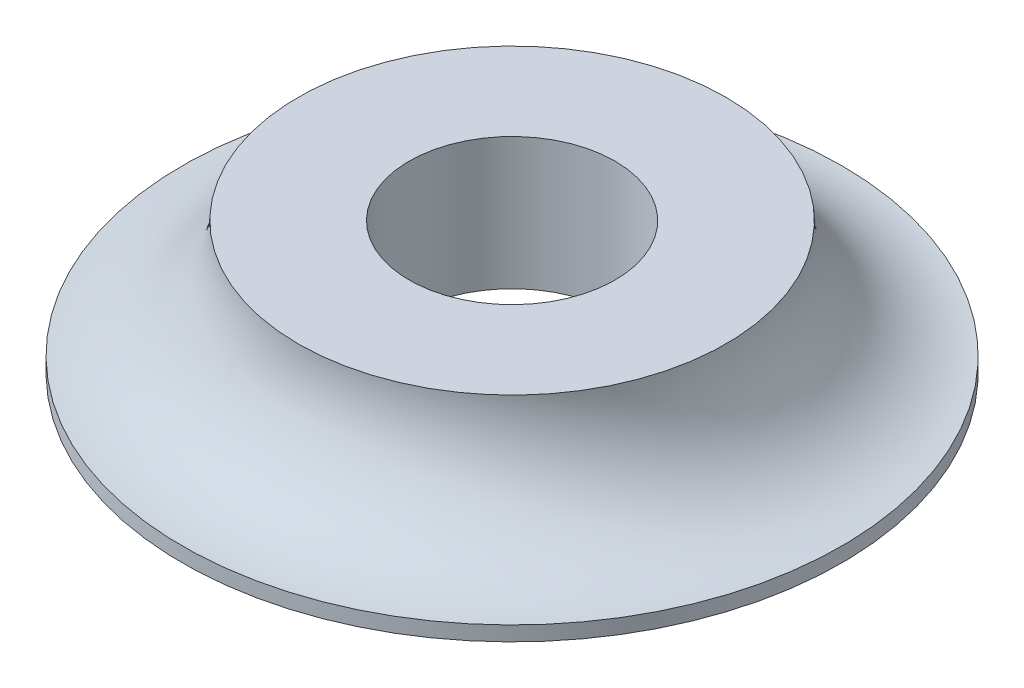
ISO-10303-21;
HEADER;
FILE_DESCRIPTION(('STEP AP214'),'2;1');
FILE_NAME('part.step','',(''),(''),'','','');
FILE_SCHEMA(('AUTOMOTIVE_DESIGN { 1 0 10303 214 1 1 1 1 }'));
ENDSEC;
DATA;
#1=APPLICATION_CONTEXT('core data for automotive mechanical design processes');
#2=APPLICATION_PROTOCOL_DEFINITION('international standard','automotive_design',2000,#1);
#3=PRODUCT_CONTEXT('',#1,'mechanical');
#4=PRODUCT('Part','Part','',(#3));
#5=PRODUCT_RELATED_PRODUCT_CATEGORY('part','',(#4));
#6=PRODUCT_DEFINITION_FORMATION('','',#4);
#7=PRODUCT_DEFINITION_CONTEXT('part definition',#1,'design');
#8=PRODUCT_DEFINITION('design','',#6,#7);
#9=PRODUCT_DEFINITION_SHAPE('','',#8);
#10=(LENGTH_UNIT() NAMED_UNIT(*) SI_UNIT(.MILLI.,.METRE.));
#11=(NAMED_UNIT(*) PLANE_ANGLE_UNIT() SI_UNIT($,.RADIAN.));
#12=(NAMED_UNIT(*) SI_UNIT($,.STERADIAN.) SOLID_ANGLE_UNIT());
#13=UNCERTAINTY_MEASURE_WITH_UNIT(LENGTH_MEASURE(1.E-05),#10,'distance_accuracy_value','');
#14=(GEOMETRIC_REPRESENTATION_CONTEXT(3) GLOBAL_UNCERTAINTY_ASSIGNED_CONTEXT((#13)) GLOBAL_UNIT_ASSIGNED_CONTEXT((#10,
#11,#12)) REPRESENTATION_CONTEXT('',''));
#15=CARTESIAN_POINT('',(0.,0.,0.));
#16=DIRECTION('',(0.,0.,1.));
#17=DIRECTION('',(1.,0.,0.));
#18=AXIS2_PLACEMENT_3D('',#15,#16,#17);
#19=CARTESIAN_POINT('',(0.,0.,0.));
#20=DIRECTION('',(0.,-1.,0.));
#21=DIRECTION('',(0.,0.,-1.));
#22=AXIS2_PLACEMENT_3D('',#19,#20,#21);
#23=CYLINDRICAL_SURFACE('',#22,12.7);
#24=CARTESIAN_POINT('',(0.,0.565718662706161,0.));
#25=DIRECTION('',(0.,-1.,0.));
#26=DIRECTION('',(0.,0.,-1.));
#27=AXIS2_PLACEMENT_3D('',#24,#25,#26);
#28=CIRCLE('',#27,12.7);
#29=CARTESIAN_POINT('',(0.,0.565718662706161,-12.7));
#30=VERTEX_POINT('',#29);
#31=EDGE_CURVE('E50',#30,#30,#28,.T.);
#32=ORIENTED_EDGE('',*,*,#31,.T.);
#33=EDGE_LOOP('',(#32));
#34=FACE_BOUND('',#33,.T.);
#35=CARTESIAN_POINT('',(0.,0.,0.));
#36=DIRECTION('',(0.,-1.,0.));
#37=DIRECTION('',(0.,0.,-1.));
#38=AXIS2_PLACEMENT_3D('',#35,#36,#37);
#39=CIRCLE('',#38,12.7);
#40=CARTESIAN_POINT('',(0.,0.,-12.7));
#41=VERTEX_POINT('',#40);
#42=EDGE_CURVE('E10',#41,#41,#39,.T.);
#43=ORIENTED_EDGE('',*,*,#42,.F.);
#44=EDGE_LOOP('',(#43));
#45=FACE_BOUND('',#44,.T.);
#46=ADVANCED_FACE('F31',(#34,#45),#23,.T.);
#47=CARTESIAN_POINT('',(3.96875,0.,0.));
#48=DIRECTION('',(0.,-1.,0.));
#49=DIRECTION('',(0.,0.,-1.));
#50=AXIS2_PLACEMENT_3D('',#47,#48,#49);
#51=PLANE('',#50);
#52=ORIENTED_EDGE('',*,*,#42,.T.);
#53=EDGE_LOOP('',(#52));
#54=FACE_BOUND('',#53,.T.);
#55=CARTESIAN_POINT('',(0.,0.,0.));
#56=DIRECTION('',(0.,-1.,0.));
#57=DIRECTION('',(0.,0.,-1.));
#58=AXIS2_PLACEMENT_3D('',#55,#56,#57);
#59=CIRCLE('',#58,3.96875);
#60=CARTESIAN_POINT('',(0.,0.,-3.96875));
#61=VERTEX_POINT('',#60);
#62=EDGE_CURVE('E37',#61,#61,#59,.T.);
#63=ORIENTED_EDGE('',*,*,#62,.F.);
#64=EDGE_LOOP('',(#63));
#65=FACE_BOUND('',#64,.T.);
#66=ADVANCED_FACE('F68',(#54,#65),#51,.T.);
#67=CARTESIAN_POINT('',(0.,0.,0.));
#68=DIRECTION('',(0.,-1.,0.));
#69=DIRECTION('',(0.,0.,-1.));
#70=AXIS2_PLACEMENT_3D('',#67,#68,#69);
#71=CYLINDRICAL_SURFACE('',#70,3.96875);
#72=ORIENTED_EDGE('',*,*,#62,.T.);
#73=EDGE_LOOP('',(#72));
#74=FACE_BOUND('',#73,.T.);
#75=CARTESIAN_POINT('',(0.,5.08,0.));
#76=DIRECTION('',(0.,-1.,0.));
#77=DIRECTION('',(0.,0.,-1.));
#78=AXIS2_PLACEMENT_3D('',#75,#76,#77);
#79=CIRCLE('',#78,3.96875);
#80=CARTESIAN_POINT('',(0.,5.08,-3.96875));
#81=VERTEX_POINT('',#80);
#82=EDGE_CURVE('E41',#81,#81,#79,.T.);
#83=ORIENTED_EDGE('',*,*,#82,.F.);
#84=EDGE_LOOP('',(#83));
#85=FACE_BOUND('',#84,.T.);
#86=ADVANCED_FACE('F64',(#74,#85),#71,.F.);
#87=CARTESIAN_POINT('',(3.96875,5.08,0.));
#88=DIRECTION('',(0.,1.,0.));
#89=DIRECTION('',(0.,0.,1.));
#90=AXIS2_PLACEMENT_3D('',#87,#88,#89);
#91=PLANE('',#90);
#92=ORIENTED_EDGE('',*,*,#82,.T.);
#93=EDGE_LOOP('',(#92));
#94=FACE_BOUND('',#93,.T.);
#95=CARTESIAN_POINT('',(0.,5.08,0.));
#96=DIRECTION('',(0.,-1.,0.));
#97=DIRECTION('',(0.,0.,-1.));
#98=AXIS2_PLACEMENT_3D('',#95,#96,#97);
#99=CIRCLE('',#98,8.23702806859673);
#100=CARTESIAN_POINT('',(0.,5.08,-8.23702806859673));
#101=VERTEX_POINT('',#100);
#102=EDGE_CURVE('E45',#101,#101,#99,.T.);
#103=ORIENTED_EDGE('',*,*,#102,.F.);
#104=EDGE_LOOP('',(#103));
#105=FACE_BOUND('',#104,.T.);
#106=ADVANCED_FACE('F58',(#94,#105),#91,.T.);
#107=CARTESIAN_POINT('',(0.,5.05434529705472,0.));
#108=DIRECTION('',(0.,-1.,0.));
#109=DIRECTION('',(0.,0.,-1.));
#110=AXIS2_PLACEMENT_3D('',#107,#108,#109);
#111=TOROIDAL_SURFACE('',#110,12.7256547029453,4.48869994835548);
#112=ORIENTED_EDGE('',*,*,#102,.T.);
#113=EDGE_LOOP('',(#112));
#114=FACE_BOUND('',#113,.T.);
#115=ORIENTED_EDGE('',*,*,#31,.F.);
#116=EDGE_LOOP('',(#115));
#117=FACE_BOUND('',#116,.T.);
#118=ADVANCED_FACE('F56',(#114,#117),#111,.F.);
#119=CLOSED_SHELL('',(#46,#66,#86,#106,#118));
#120=MANIFOLD_SOLID_BREP('B2',#119);
#121=ADVANCED_BREP_SHAPE_REPRESENTATION('',(#18,#120),#14);
#122=SHAPE_DEFINITION_REPRESENTATION(#9,#121);
ENDSEC;
END-ISO-10303-21;
